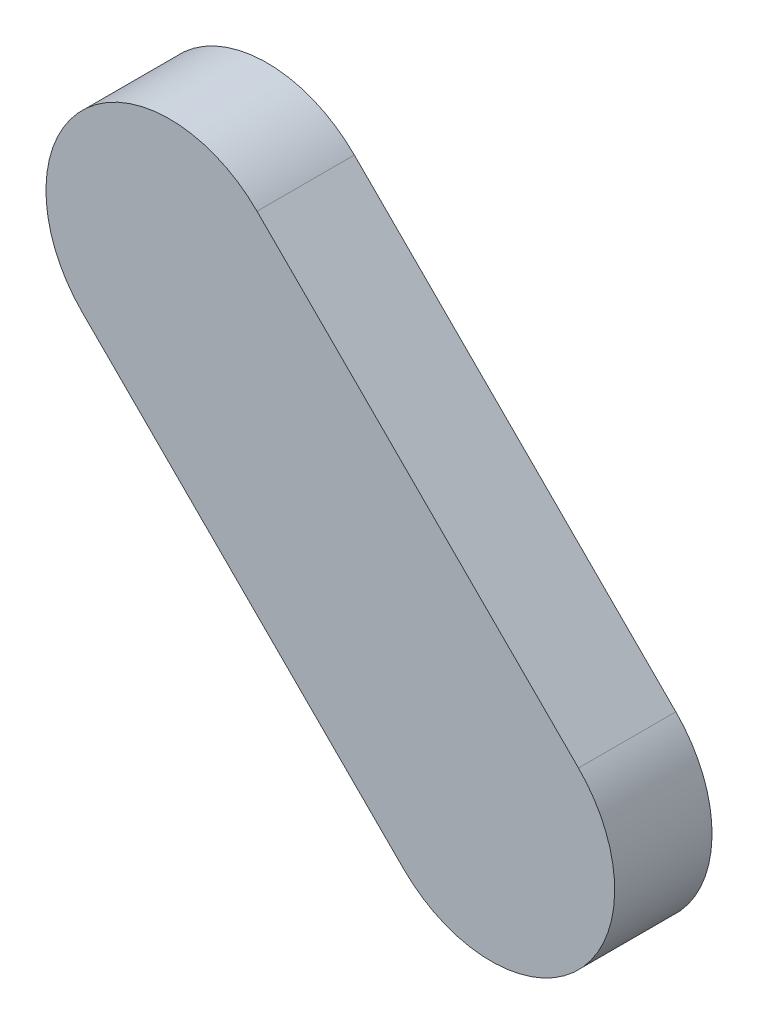
ISO-10303-21;
HEADER;
FILE_DESCRIPTION(('STEP AP214'),'2;1');
FILE_NAME('part.step','',(''),(''),'','','');
FILE_SCHEMA(('AUTOMOTIVE_DESIGN { 1 0 10303 214 1 1 1 1 }'));
ENDSEC;
DATA;
#1=APPLICATION_CONTEXT('core data for automotive mechanical design processes');
#2=APPLICATION_PROTOCOL_DEFINITION('international standard','automotive_design',2000,#1);
#3=PRODUCT_CONTEXT('',#1,'mechanical');
#4=PRODUCT('Part','Part','',(#3));
#5=PRODUCT_RELATED_PRODUCT_CATEGORY('part','',(#4));
#6=PRODUCT_DEFINITION_FORMATION('','',#4);
#7=PRODUCT_DEFINITION_CONTEXT('part definition',#1,'design');
#8=PRODUCT_DEFINITION('design','',#6,#7);
#9=PRODUCT_DEFINITION_SHAPE('','',#8);
#10=(LENGTH_UNIT() NAMED_UNIT(*) SI_UNIT(.MILLI.,.METRE.));
#11=(NAMED_UNIT(*) PLANE_ANGLE_UNIT() SI_UNIT($,.RADIAN.));
#12=(NAMED_UNIT(*) SI_UNIT($,.STERADIAN.) SOLID_ANGLE_UNIT());
#13=UNCERTAINTY_MEASURE_WITH_UNIT(LENGTH_MEASURE(1.E-05),#10,'distance_accuracy_value','');
#14=(GEOMETRIC_REPRESENTATION_CONTEXT(3) GLOBAL_UNCERTAINTY_ASSIGNED_CONTEXT((#13)) GLOBAL_UNIT_ASSIGNED_CONTEXT((#10,
#11,#12)) REPRESENTATION_CONTEXT('',''));
#15=CARTESIAN_POINT('',(0.,0.,0.));
#16=DIRECTION('',(0.,0.,1.));
#17=DIRECTION('',(1.,0.,0.));
#18=AXIS2_PLACEMENT_3D('',#15,#16,#17);
#19=CARTESIAN_POINT('',(115.46659406,79.80499406,0.));
#20=DIRECTION('',(0.707106781186548,0.707106781186548,0.));
#21=DIRECTION('',(0.707106781186548,-0.707106781186548,0.));
#22=AXIS2_PLACEMENT_3D('',#19,#20,#21);
#23=PLANE('',#22);
#24=DIRECTION('',(0.707106781186548,-0.707106781186548,0.));
#25=VECTOR('',#24,1.);
#26=CARTESIAN_POINT('',(115.46659406,79.80499406,0.1999996));
#27=LINE('',#26,#25);
#28=CARTESIAN_POINT('',(115.46659406,79.80499406,0.1999996));
#29=VERTEX_POINT('',#28);
#30=CARTESIAN_POINT('',(116.12699406,79.14459406,0.1999996));
#31=VERTEX_POINT('',#30);
#32=EDGE_CURVE('E11',#29,#31,#27,.T.);
#33=ORIENTED_EDGE('',*,*,#32,.F.);
#34=DIRECTION('',(0.,0.,1.));
#35=VECTOR('',#34,1.);
#36=CARTESIAN_POINT('',(115.46659406,79.80499406,0.));
#37=LINE('',#36,#35);
#38=CARTESIAN_POINT('',(115.46659406,79.80499406,0.));
#39=VERTEX_POINT('',#38);
#40=EDGE_CURVE('E24',#39,#29,#37,.T.);
#41=ORIENTED_EDGE('',*,*,#40,.F.);
#42=DIRECTION('',(0.707106781186548,-0.707106781186548,0.));
#43=VECTOR('',#42,1.);
#44=CARTESIAN_POINT('',(115.46659406,79.80499406,0.));
#45=LINE('',#44,#43);
#46=CARTESIAN_POINT('',(116.12699406,79.14459406,0.));
#47=VERTEX_POINT('',#46);
#48=EDGE_CURVE('E75',#39,#47,#45,.T.);
#49=ORIENTED_EDGE('',*,*,#48,.T.);
#50=DIRECTION('',(0.,0.,1.));
#51=VECTOR('',#50,1.);
#52=CARTESIAN_POINT('',(116.12699406,79.14459406,0.));
#53=LINE('',#52,#51);
#54=EDGE_CURVE('E37',#47,#31,#53,.T.);
#55=ORIENTED_EDGE('',*,*,#54,.T.);
#56=EDGE_LOOP('',(#33,#41,#49,#55));
#57=FACE_BOUND('',#56,.T.);
#58=ADVANCED_FACE('F17',(#57),#23,.F.);
#59=CARTESIAN_POINT('',(116.3066,79.3242,0.));
#60=DIRECTION('',(0.,0.,-1.));
#61=DIRECTION('',(-0.707106781186576,-0.70710678118652,0.));
#62=AXIS2_PLACEMENT_3D('',#59,#60,#61);
#63=CYLINDRICAL_SURFACE('',#62,0.254001156230764);
#64=CARTESIAN_POINT('',(116.3066,79.3242,0.1999996));
#65=DIRECTION('',(0.,0.,1.));
#66=DIRECTION('',(-0.707106781186576,-0.70710678118652,0.));
#67=AXIS2_PLACEMENT_3D('',#64,#65,#66);
#68=CIRCLE('',#67,0.254001156230764);
#69=CARTESIAN_POINT('',(116.48620594,79.50380594,0.1999996));
#70=VERTEX_POINT('',#69);
#71=EDGE_CURVE('E83',#31,#70,#68,.T.);
#72=ORIENTED_EDGE('',*,*,#71,.F.);
#73=ORIENTED_EDGE('',*,*,#54,.F.);
#74=CARTESIAN_POINT('',(116.3066,79.3242,0.));
#75=DIRECTION('',(0.,0.,1.));
#76=DIRECTION('',(-0.707106781186576,-0.70710678118652,0.));
#77=AXIS2_PLACEMENT_3D('',#74,#75,#76);
#78=CIRCLE('',#77,0.254001156230764);
#79=CARTESIAN_POINT('',(116.48620594,79.50380594,0.));
#80=VERTEX_POINT('',#79);
#81=EDGE_CURVE('E81',#47,#80,#78,.T.);
#82=ORIENTED_EDGE('',*,*,#81,.T.);
#83=DIRECTION('',(0.,0.,1.));
#84=VECTOR('',#83,1.);
#85=CARTESIAN_POINT('',(116.48620594,79.50380594,0.));
#86=LINE('',#85,#84);
#87=EDGE_CURVE('E67',#80,#70,#86,.T.);
#88=ORIENTED_EDGE('',*,*,#87,.T.);
#89=EDGE_LOOP('',(#72,#73,#82,#88));
#90=FACE_BOUND('',#89,.T.);
#91=ADVANCED_FACE('F89',(#90),#63,.T.);
#92=CARTESIAN_POINT('',(116.48620594,79.50380594,0.));
#93=DIRECTION('',(-0.707106781186548,-0.707106781186548,0.));
#94=DIRECTION('',(-0.707106781186548,0.707106781186548,0.));
#95=AXIS2_PLACEMENT_3D('',#92,#93,#94);
#96=PLANE('',#95);
#97=DIRECTION('',(-0.707106781186548,0.707106781186548,0.));
#98=VECTOR('',#97,1.);
#99=CARTESIAN_POINT('',(116.48620594,79.50380594,0.1999996));
#100=LINE('',#99,#98);
#101=CARTESIAN_POINT('',(115.82580594,80.16420594,0.1999996));
#102=VERTEX_POINT('',#101);
#103=EDGE_CURVE('E71',#70,#102,#100,.T.);
#104=ORIENTED_EDGE('',*,*,#103,.F.);
#105=ORIENTED_EDGE('',*,*,#87,.F.);
#106=DIRECTION('',(-0.707106781186548,0.707106781186548,0.));
#107=VECTOR('',#106,1.);
#108=CARTESIAN_POINT('',(116.48620594,79.50380594,0.));
#109=LINE('',#108,#107);
#110=CARTESIAN_POINT('',(115.82580594,80.16420594,0.));
#111=VERTEX_POINT('',#110);
#112=EDGE_CURVE('E63',#80,#111,#109,.T.);
#113=ORIENTED_EDGE('',*,*,#112,.T.);
#114=DIRECTION('',(0.,0.,1.));
#115=VECTOR('',#114,1.);
#116=CARTESIAN_POINT('',(115.82580594,80.16420594,0.));
#117=LINE('',#116,#115);
#118=EDGE_CURVE('E53',#111,#102,#117,.T.);
#119=ORIENTED_EDGE('',*,*,#118,.T.);
#120=EDGE_LOOP('',(#104,#105,#113,#119));
#121=FACE_BOUND('',#120,.T.);
#122=ADVANCED_FACE('F66',(#121),#96,.F.);
#123=CARTESIAN_POINT('',(115.6462,79.9846,0.));
#124=DIRECTION('',(0.,0.,-1.));
#125=DIRECTION('',(0.707106781186576,0.70710678118652,0.));
#126=AXIS2_PLACEMENT_3D('',#123,#124,#125);
#127=CYLINDRICAL_SURFACE('',#126,0.254001156230764);
#128=CARTESIAN_POINT('',(115.6462,79.9846,0.1999996));
#129=DIRECTION('',(0.,0.,1.));
#130=DIRECTION('',(0.707106781186576,0.70710678118652,0.));
#131=AXIS2_PLACEMENT_3D('',#128,#129,#130);
#132=CIRCLE('',#131,0.254001156230764);
#133=EDGE_CURVE('E59',#102,#29,#132,.T.);
#134=ORIENTED_EDGE('',*,*,#133,.F.);
#135=ORIENTED_EDGE('',*,*,#118,.F.);
#136=CARTESIAN_POINT('',(115.6462,79.9846,0.));
#137=DIRECTION('',(0.,0.,1.));
#138=DIRECTION('',(0.707106781186576,0.70710678118652,0.));
#139=AXIS2_PLACEMENT_3D('',#136,#137,#138);
#140=CIRCLE('',#139,0.254001156230764);
#141=EDGE_CURVE('E57',#111,#39,#140,.T.);
#142=ORIENTED_EDGE('',*,*,#141,.T.);
#143=ORIENTED_EDGE('',*,*,#40,.T.);
#144=EDGE_LOOP('',(#134,#135,#142,#143));
#145=FACE_BOUND('',#144,.T.);
#146=ADVANCED_FACE('F55',(#145),#127,.T.);
#147=CARTESIAN_POINT('',(115.46659406,79.80499406,0.));
#148=DIRECTION('',(0.,0.,-1.));
#149=DIRECTION('',(-1.,0.,0.));
#150=AXIS2_PLACEMENT_3D('',#147,#148,#149);
#151=PLANE('',#150);
#152=ORIENTED_EDGE('',*,*,#141,.F.);
#153=ORIENTED_EDGE('',*,*,#112,.F.);
#154=ORIENTED_EDGE('',*,*,#81,.F.);
#155=ORIENTED_EDGE('',*,*,#48,.F.);
#156=EDGE_LOOP('',(#152,#153,#154,#155));
#157=FACE_BOUND('',#156,.T.);
#158=ADVANCED_FACE('F74',(#157),#151,.T.);
#159=CARTESIAN_POINT('',(115.46659406,79.80499406,0.1999996));
#160=DIRECTION('',(0.,0.,-1.));
#161=DIRECTION('',(-1.,0.,0.));
#162=AXIS2_PLACEMENT_3D('',#159,#160,#161);
#163=PLANE('',#162);
#164=ORIENTED_EDGE('',*,*,#32,.T.);
#165=ORIENTED_EDGE('',*,*,#71,.T.);
#166=ORIENTED_EDGE('',*,*,#103,.T.);
#167=ORIENTED_EDGE('',*,*,#133,.T.);
#168=EDGE_LOOP('',(#164,#165,#166,#167));
#169=FACE_BOUND('',#168,.T.);
#170=ADVANCED_FACE('F91',(#169),#163,.F.);
#171=CLOSED_SHELL('',(#58,#91,#122,#146,#158,#170));
#172=MANIFOLD_SOLID_BREP('B1',#171);
#173=ADVANCED_BREP_SHAPE_REPRESENTATION('',(#18,#172),#14);
#174=SHAPE_DEFINITION_REPRESENTATION(#9,#173);
ENDSEC;
END-ISO-10303-21;
